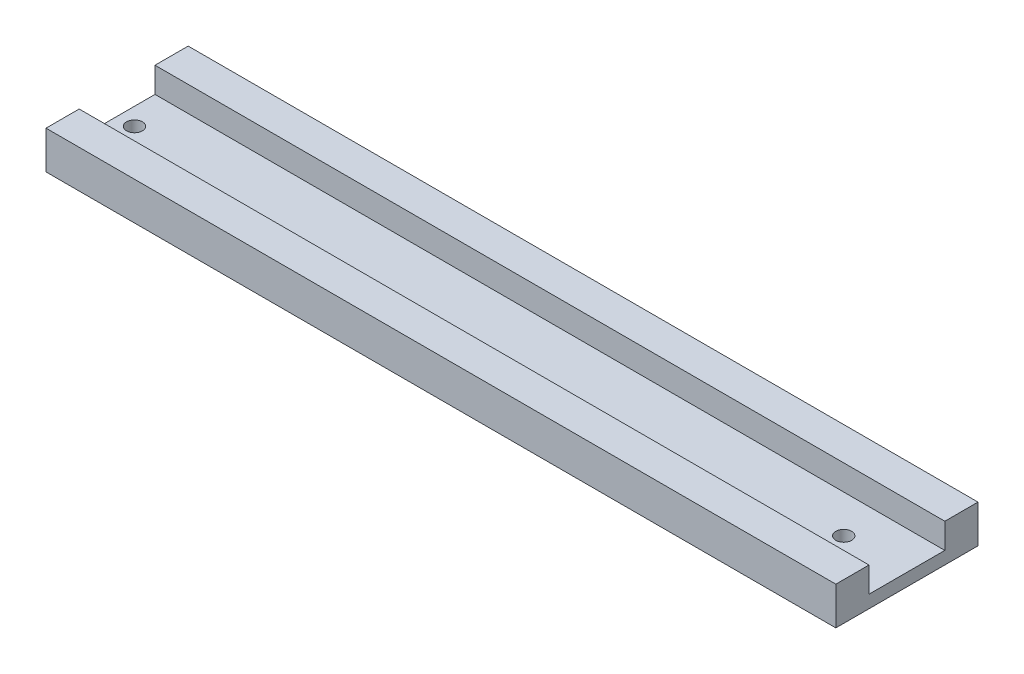
ISO-10303-21;
HEADER;
FILE_DESCRIPTION(('STEP AP214'),'2;1');
FILE_NAME('part.step','',(''),(''),'','','');
FILE_SCHEMA(('AUTOMOTIVE_DESIGN { 1 0 10303 214 1 1 1 1 }'));
ENDSEC;
DATA;
#1=APPLICATION_CONTEXT('core data for automotive mechanical design processes');
#2=APPLICATION_PROTOCOL_DEFINITION('international standard','automotive_design',2000,#1);
#3=PRODUCT_CONTEXT('',#1,'mechanical');
#4=PRODUCT('Part','Part','',(#3));
#5=PRODUCT_RELATED_PRODUCT_CATEGORY('part','',(#4));
#6=PRODUCT_DEFINITION_FORMATION('','',#4);
#7=PRODUCT_DEFINITION_CONTEXT('part definition',#1,'design');
#8=PRODUCT_DEFINITION('design','',#6,#7);
#9=PRODUCT_DEFINITION_SHAPE('','',#8);
#10=(LENGTH_UNIT() NAMED_UNIT(*) SI_UNIT(.MILLI.,.METRE.));
#11=(NAMED_UNIT(*) PLANE_ANGLE_UNIT() SI_UNIT($,.RADIAN.));
#12=(NAMED_UNIT(*) SI_UNIT($,.STERADIAN.) SOLID_ANGLE_UNIT());
#13=UNCERTAINTY_MEASURE_WITH_UNIT(LENGTH_MEASURE(1.E-05),#10,'distance_accuracy_value','');
#14=(GEOMETRIC_REPRESENTATION_CONTEXT(3) GLOBAL_UNCERTAINTY_ASSIGNED_CONTEXT((#13)) GLOBAL_UNIT_ASSIGNED_CONTEXT((#10,
#11,#12)) REPRESENTATION_CONTEXT('',''));
#15=CARTESIAN_POINT('',(0.,0.,0.));
#16=DIRECTION('',(0.,0.,1.));
#17=DIRECTION('',(1.,0.,0.));
#18=AXIS2_PLACEMENT_3D('',#15,#16,#17);
#19=CARTESIAN_POINT('',(250.,0.,-12.));
#20=DIRECTION('',(0.,0.,1.));
#21=DIRECTION('',(1.,0.,0.));
#22=AXIS2_PLACEMENT_3D('',#19,#20,#21);
#23=PLANE('',#22);
#24=DIRECTION('',(0.,1.,0.));
#25=VECTOR('',#24,1.);
#26=CARTESIAN_POINT('',(0.,0.,-12.));
#27=LINE('',#26,#25);
#28=CARTESIAN_POINT('',(0.,-2.,-12.));
#29=VERTEX_POINT('',#28);
#30=CARTESIAN_POINT('',(0.,6.,-12.));
#31=VERTEX_POINT('',#30);
#32=EDGE_CURVE('E140',#29,#31,#27,.T.);
#33=ORIENTED_EDGE('',*,*,#32,.F.);
#34=DIRECTION('',(-1.,0.,0.));
#35=VECTOR('',#34,1.);
#36=CARTESIAN_POINT('',(250.,-2.,-12.));
#37=LINE('',#36,#35);
#38=CARTESIAN_POINT('',(250.,-2.,-12.));
#39=VERTEX_POINT('',#38);
#40=EDGE_CURVE('E11',#39,#29,#37,.T.);
#41=ORIENTED_EDGE('',*,*,#40,.F.);
#42=DIRECTION('',(0.,1.,0.));
#43=VECTOR('',#42,1.);
#44=CARTESIAN_POINT('',(250.,0.,-12.));
#45=LINE('',#44,#43);
#46=CARTESIAN_POINT('',(250.,6.,-12.));
#47=VERTEX_POINT('',#46);
#48=EDGE_CURVE('E196',#39,#47,#45,.T.);
#49=ORIENTED_EDGE('',*,*,#48,.T.);
#50=DIRECTION('',(-1.,0.,0.));
#51=VECTOR('',#50,1.);
#52=CARTESIAN_POINT('',(250.,6.,-12.));
#53=LINE('',#52,#51);
#54=EDGE_CURVE('E58',#47,#31,#53,.T.);
#55=ORIENTED_EDGE('',*,*,#54,.T.);
#56=EDGE_LOOP('',(#33,#41,#49,#55));
#57=FACE_BOUND('',#56,.T.);
#58=ADVANCED_FACE('F41',(#57),#23,.T.);
#59=CARTESIAN_POINT('',(250.,-2.,0.));
#60=DIRECTION('',(0.,1.,0.));
#61=DIRECTION('',(0.,0.,1.));
#62=AXIS2_PLACEMENT_3D('',#59,#60,#61);
#63=PLANE('',#62);
#64=CARTESIAN_POINT('',(230.,-2.,0.));
#65=DIRECTION('',(0.,1.,0.));
#66=DIRECTION('',(0.,0.,1.));
#67=AXIS2_PLACEMENT_3D('',#64,#65,#66);
#68=CIRCLE('',#67,2.5);
#69=CARTESIAN_POINT('',(230.,-2.,2.5));
#70=VERTEX_POINT('',#69);
#71=EDGE_CURVE('E144',#70,#70,#68,.T.);
#72=ORIENTED_EDGE('',*,*,#71,.F.);
#73=EDGE_LOOP('',(#72));
#74=FACE_BOUND('',#73,.T.);
#75=CARTESIAN_POINT('',(5.5,-2.,0.));
#76=DIRECTION('',(0.,1.,0.));
#77=DIRECTION('',(0.,0.,1.));
#78=AXIS2_PLACEMENT_3D('',#75,#76,#77);
#79=CIRCLE('',#78,2.5);
#80=CARTESIAN_POINT('',(5.5,-2.,2.5));
#81=VERTEX_POINT('',#80);
#82=EDGE_CURVE('E320',#81,#81,#79,.T.);
#83=ORIENTED_EDGE('',*,*,#82,.F.);
#84=EDGE_LOOP('',(#83));
#85=FACE_BOUND('',#84,.T.);
#86=DIRECTION('',(0.,0.,-1.));
#87=VECTOR('',#86,1.);
#88=CARTESIAN_POINT('',(0.,-2.,0.));
#89=LINE('',#88,#87);
#90=CARTESIAN_POINT('',(0.,-2.,12.));
#91=VERTEX_POINT('',#90);
#92=EDGE_CURVE('E143',#91,#29,#89,.T.);
#93=ORIENTED_EDGE('',*,*,#92,.F.);
#94=DIRECTION('',(-1.,0.,0.));
#95=VECTOR('',#94,1.);
#96=CARTESIAN_POINT('',(250.,-2.,12.));
#97=LINE('',#96,#95);
#98=CARTESIAN_POINT('',(250.,-2.,12.));
#99=VERTEX_POINT('',#98);
#100=EDGE_CURVE('E50',#99,#91,#97,.T.);
#101=ORIENTED_EDGE('',*,*,#100,.F.);
#102=DIRECTION('',(0.,0.,-1.));
#103=VECTOR('',#102,1.);
#104=CARTESIAN_POINT('',(250.,-2.,0.));
#105=LINE('',#104,#103);
#106=EDGE_CURVE('E192',#99,#39,#105,.T.);
#107=ORIENTED_EDGE('',*,*,#106,.T.);
#108=ORIENTED_EDGE('',*,*,#40,.T.);
#109=EDGE_LOOP('',(#93,#101,#107,#108));
#110=FACE_BOUND('',#109,.T.);
#111=ADVANCED_FACE('F191',(#74,#85,#110),#63,.T.);
#112=CARTESIAN_POINT('',(250.,0.,12.));
#113=DIRECTION('',(0.,0.,1.));
#114=DIRECTION('',(1.,0.,0.));
#115=AXIS2_PLACEMENT_3D('',#112,#113,#114);
#116=PLANE('',#115);
#117=DIRECTION('',(0.,1.,0.));
#118=VECTOR('',#117,1.);
#119=CARTESIAN_POINT('',(0.,0.,12.));
#120=LINE('',#119,#118);
#121=CARTESIAN_POINT('',(0.,6.,12.));
#122=VERTEX_POINT('',#121);
#123=EDGE_CURVE('E148',#91,#122,#120,.T.);
#124=ORIENTED_EDGE('',*,*,#123,.T.);
#125=DIRECTION('',(-1.,0.,0.));
#126=VECTOR('',#125,1.);
#127=CARTESIAN_POINT('',(250.,6.,12.));
#128=LINE('',#127,#126);
#129=CARTESIAN_POINT('',(250.,6.,12.));
#130=VERTEX_POINT('',#129);
#131=EDGE_CURVE('E175',#130,#122,#128,.T.);
#132=ORIENTED_EDGE('',*,*,#131,.F.);
#133=DIRECTION('',(0.,1.,0.));
#134=VECTOR('',#133,1.);
#135=CARTESIAN_POINT('',(250.,0.,12.));
#136=LINE('',#135,#134);
#137=EDGE_CURVE('E183',#99,#130,#136,.T.);
#138=ORIENTED_EDGE('',*,*,#137,.F.);
#139=ORIENTED_EDGE('',*,*,#100,.T.);
#140=EDGE_LOOP('',(#124,#132,#138,#139));
#141=FACE_BOUND('',#140,.T.);
#142=ADVANCED_FACE('F181',(#141),#116,.F.);
#143=CARTESIAN_POINT('',(250.,6.,0.));
#144=DIRECTION('',(0.,1.,0.));
#145=DIRECTION('',(0.,0.,1.));
#146=AXIS2_PLACEMENT_3D('',#143,#144,#145);
#147=PLANE('',#146);
#148=DIRECTION('',(0.,0.,-1.));
#149=VECTOR('',#148,1.);
#150=CARTESIAN_POINT('',(0.,6.,0.));
#151=LINE('',#150,#149);
#152=CARTESIAN_POINT('',(0.,6.,22.5));
#153=VERTEX_POINT('',#152);
#154=EDGE_CURVE('E152',#153,#122,#151,.T.);
#155=ORIENTED_EDGE('',*,*,#154,.F.);
#156=DIRECTION('',(-1.,0.,0.));
#157=VECTOR('',#156,1.);
#158=CARTESIAN_POINT('',(250.,6.,22.5));
#159=LINE('',#158,#157);
#160=CARTESIAN_POINT('',(250.,6.,22.5));
#161=VERTEX_POINT('',#160);
#162=EDGE_CURVE('E172',#161,#153,#159,.T.);
#163=ORIENTED_EDGE('',*,*,#162,.F.);
#164=DIRECTION('',(0.,0.,-1.));
#165=VECTOR('',#164,1.);
#166=CARTESIAN_POINT('',(250.,6.,0.));
#167=LINE('',#166,#165);
#168=EDGE_CURVE('E137',#161,#130,#167,.T.);
#169=ORIENTED_EDGE('',*,*,#168,.T.);
#170=ORIENTED_EDGE('',*,*,#131,.T.);
#171=EDGE_LOOP('',(#155,#163,#169,#170));
#172=FACE_BOUND('',#171,.T.);
#173=ADVANCED_FACE('F212',(#172),#147,.T.);
#174=CARTESIAN_POINT('',(250.,0.,22.5));
#175=DIRECTION('',(0.,0.,1.));
#176=DIRECTION('',(1.,0.,0.));
#177=AXIS2_PLACEMENT_3D('',#174,#175,#176);
#178=PLANE('',#177);
#179=DIRECTION('',(0.,1.,0.));
#180=VECTOR('',#179,1.);
#181=CARTESIAN_POINT('',(0.,0.,22.5));
#182=LINE('',#181,#180);
#183=CARTESIAN_POINT('',(0.,-6.,22.5));
#184=VERTEX_POINT('',#183);
#185=EDGE_CURVE('E156',#184,#153,#182,.T.);
#186=ORIENTED_EDGE('',*,*,#185,.F.);
#187=DIRECTION('',(-1.,0.,0.));
#188=VECTOR('',#187,1.);
#189=CARTESIAN_POINT('',(250.,-6.,22.5));
#190=LINE('',#189,#188);
#191=CARTESIAN_POINT('',(250.,-6.,22.5));
#192=VERTEX_POINT('',#191);
#193=EDGE_CURVE('E129',#192,#184,#190,.T.);
#194=ORIENTED_EDGE('',*,*,#193,.F.);
#195=DIRECTION('',(0.,1.,0.));
#196=VECTOR('',#195,1.);
#197=CARTESIAN_POINT('',(250.,0.,22.5));
#198=LINE('',#197,#196);
#199=EDGE_CURVE('E117',#192,#161,#198,.T.);
#200=ORIENTED_EDGE('',*,*,#199,.T.);
#201=ORIENTED_EDGE('',*,*,#162,.T.);
#202=EDGE_LOOP('',(#186,#194,#200,#201));
#203=FACE_BOUND('',#202,.T.);
#204=ADVANCED_FACE('F210',(#203),#178,.T.);
#205=CARTESIAN_POINT('',(250.,-6.,0.));
#206=DIRECTION('',(0.,1.,0.));
#207=DIRECTION('',(0.,0.,1.));
#208=AXIS2_PLACEMENT_3D('',#205,#206,#207);
#209=PLANE('',#208);
#210=CARTESIAN_POINT('',(230.,-6.,0.));
#211=DIRECTION('',(0.,1.,0.));
#212=DIRECTION('',(0.,0.,1.));
#213=AXIS2_PLACEMENT_3D('',#210,#211,#212);
#214=CIRCLE('',#213,2.5);
#215=CARTESIAN_POINT('',(230.,-6.,2.5));
#216=VERTEX_POINT('',#215);
#217=EDGE_CURVE('E318',#216,#216,#214,.T.);
#218=ORIENTED_EDGE('',*,*,#217,.T.);
#219=EDGE_LOOP('',(#218));
#220=FACE_BOUND('',#219,.T.);
#221=CARTESIAN_POINT('',(5.5,-6.,0.));
#222=DIRECTION('',(0.,1.,0.));
#223=DIRECTION('',(0.,0.,1.));
#224=AXIS2_PLACEMENT_3D('',#221,#222,#223);
#225=CIRCLE('',#224,2.5);
#226=CARTESIAN_POINT('',(5.5,-6.,2.5));
#227=VERTEX_POINT('',#226);
#228=EDGE_CURVE('E321',#227,#227,#225,.T.);
#229=ORIENTED_EDGE('',*,*,#228,.T.);
#230=EDGE_LOOP('',(#229));
#231=FACE_BOUND('',#230,.T.);
#232=DIRECTION('',(0.,0.,-1.));
#233=VECTOR('',#232,1.);
#234=CARTESIAN_POINT('',(0.,-6.,0.));
#235=LINE('',#234,#233);
#236=CARTESIAN_POINT('',(0.,-6.,-22.5));
#237=VERTEX_POINT('',#236);
#238=EDGE_CURVE('E125',#184,#237,#235,.T.);
#239=ORIENTED_EDGE('',*,*,#238,.T.);
#240=DIRECTION('',(-1.,0.,0.));
#241=VECTOR('',#240,1.);
#242=CARTESIAN_POINT('',(250.,-6.,-22.5));
#243=LINE('',#242,#241);
#244=CARTESIAN_POINT('',(250.,-6.,-22.5));
#245=VERTEX_POINT('',#244);
#246=EDGE_CURVE('E122',#245,#237,#243,.T.);
#247=ORIENTED_EDGE('',*,*,#246,.F.);
#248=DIRECTION('',(0.,0.,-1.));
#249=VECTOR('',#248,1.);
#250=CARTESIAN_POINT('',(250.,-6.,0.));
#251=LINE('',#250,#249);
#252=EDGE_CURVE('E109',#192,#245,#251,.T.);
#253=ORIENTED_EDGE('',*,*,#252,.F.);
#254=ORIENTED_EDGE('',*,*,#193,.T.);
#255=EDGE_LOOP('',(#239,#247,#253,#254));
#256=FACE_BOUND('',#255,.T.);
#257=ADVANCED_FACE('F123',(#220,#231,#256),#209,.F.);
#258=CARTESIAN_POINT('',(250.,0.,-22.5));
#259=DIRECTION('',(0.,0.,1.));
#260=DIRECTION('',(1.,0.,0.));
#261=AXIS2_PLACEMENT_3D('',#258,#259,#260);
#262=PLANE('',#261);
#263=DIRECTION('',(0.,1.,0.));
#264=VECTOR('',#263,1.);
#265=CARTESIAN_POINT('',(0.,0.,-22.5));
#266=LINE('',#265,#264);
#267=CARTESIAN_POINT('',(0.,6.,-22.5));
#268=VERTEX_POINT('',#267);
#269=EDGE_CURVE('E163',#237,#268,#266,.T.);
#270=ORIENTED_EDGE('',*,*,#269,.T.);
#271=DIRECTION('',(-1.,0.,0.));
#272=VECTOR('',#271,1.);
#273=CARTESIAN_POINT('',(250.,6.,-22.5));
#274=LINE('',#273,#272);
#275=CARTESIAN_POINT('',(250.,6.,-22.5));
#276=VERTEX_POINT('',#275);
#277=EDGE_CURVE('E84',#276,#268,#274,.T.);
#278=ORIENTED_EDGE('',*,*,#277,.F.);
#279=DIRECTION('',(0.,1.,0.));
#280=VECTOR('',#279,1.);
#281=CARTESIAN_POINT('',(250.,0.,-22.5));
#282=LINE('',#281,#280);
#283=EDGE_CURVE('E114',#245,#276,#282,.T.);
#284=ORIENTED_EDGE('',*,*,#283,.F.);
#285=ORIENTED_EDGE('',*,*,#246,.T.);
#286=EDGE_LOOP('',(#270,#278,#284,#285));
#287=FACE_BOUND('',#286,.T.);
#288=ADVANCED_FACE('F131',(#287),#262,.F.);
#289=EDGE_CURVE('E157',#31,#268,#151,.T.);
#290=ORIENTED_EDGE('',*,*,#289,.F.);
#291=ORIENTED_EDGE('',*,*,#54,.F.);
#292=EDGE_CURVE('E133',#47,#276,#167,.T.);
#293=ORIENTED_EDGE('',*,*,#292,.T.);
#294=ORIENTED_EDGE('',*,*,#277,.T.);
#295=EDGE_LOOP('',(#290,#291,#293,#294));
#296=FACE_BOUND('',#295,.T.);
#297=ADVANCED_FACE('F194',(#296),#147,.T.);
#298=CARTESIAN_POINT('',(250.,0.,0.));
#299=DIRECTION('',(1.,0.,0.));
#300=DIRECTION('',(0.,0.,-1.));
#301=AXIS2_PLACEMENT_3D('',#298,#299,#300);
#302=PLANE('',#301);
#303=ORIENTED_EDGE('',*,*,#48,.F.);
#304=ORIENTED_EDGE('',*,*,#106,.F.);
#305=ORIENTED_EDGE('',*,*,#137,.T.);
#306=ORIENTED_EDGE('',*,*,#168,.F.);
#307=ORIENTED_EDGE('',*,*,#199,.F.);
#308=ORIENTED_EDGE('',*,*,#252,.T.);
#309=ORIENTED_EDGE('',*,*,#283,.T.);
#310=ORIENTED_EDGE('',*,*,#292,.F.);
#311=EDGE_LOOP('',(#303,#304,#305,#306,#307,#308,#309,#310));
#312=FACE_BOUND('',#311,.T.);
#313=ADVANCED_FACE('F111',(#312),#302,.T.);
#314=CARTESIAN_POINT('',(0.,0.,0.));
#315=DIRECTION('',(1.,0.,0.));
#316=DIRECTION('',(0.,0.,-1.));
#317=AXIS2_PLACEMENT_3D('',#314,#315,#316);
#318=PLANE('',#317);
#319=ORIENTED_EDGE('',*,*,#32,.T.);
#320=ORIENTED_EDGE('',*,*,#289,.T.);
#321=ORIENTED_EDGE('',*,*,#269,.F.);
#322=ORIENTED_EDGE('',*,*,#238,.F.);
#323=ORIENTED_EDGE('',*,*,#185,.T.);
#324=ORIENTED_EDGE('',*,*,#154,.T.);
#325=ORIENTED_EDGE('',*,*,#123,.F.);
#326=ORIENTED_EDGE('',*,*,#92,.T.);
#327=EDGE_LOOP('',(#319,#320,#321,#322,#323,#324,#325,#326));
#328=FACE_BOUND('',#327,.T.);
#329=ADVANCED_FACE('F189',(#328),#318,.F.);
#330=CARTESIAN_POINT('',(5.5,-6.,0.));
#331=DIRECTION('',(0.,1.,0.));
#332=DIRECTION('',(0.,0.,1.));
#333=AXIS2_PLACEMENT_3D('',#330,#331,#332);
#334=CYLINDRICAL_SURFACE('',#333,2.5);
#335=ORIENTED_EDGE('',*,*,#82,.T.);
#336=EDGE_LOOP('',(#335));
#337=FACE_BOUND('',#336,.T.);
#338=ORIENTED_EDGE('',*,*,#228,.F.);
#339=EDGE_LOOP('',(#338));
#340=FACE_BOUND('',#339,.T.);
#341=ADVANCED_FACE('F258',(#337,#340),#334,.F.);
#342=CARTESIAN_POINT('',(230.,-6.,0.));
#343=DIRECTION('',(0.,1.,0.));
#344=DIRECTION('',(0.,0.,1.));
#345=AXIS2_PLACEMENT_3D('',#342,#343,#344);
#346=CYLINDRICAL_SURFACE('',#345,2.5);
#347=ORIENTED_EDGE('',*,*,#71,.T.);
#348=EDGE_LOOP('',(#347));
#349=FACE_BOUND('',#348,.T.);
#350=ORIENTED_EDGE('',*,*,#217,.F.);
#351=EDGE_LOOP('',(#350));
#352=FACE_BOUND('',#351,.T.);
#353=ADVANCED_FACE('F264',(#349,#352),#346,.F.);
#354=CLOSED_SHELL('',(#58,#111,#142,#173,#204,#257,#288,#297,#313,#329,#341,#353));
#355=MANIFOLD_SOLID_BREP('B2',#354);
#356=ADVANCED_BREP_SHAPE_REPRESENTATION('',(#18,#355),#14);
#357=SHAPE_DEFINITION_REPRESENTATION(#9,#356);
ENDSEC;
END-ISO-10303-21;
